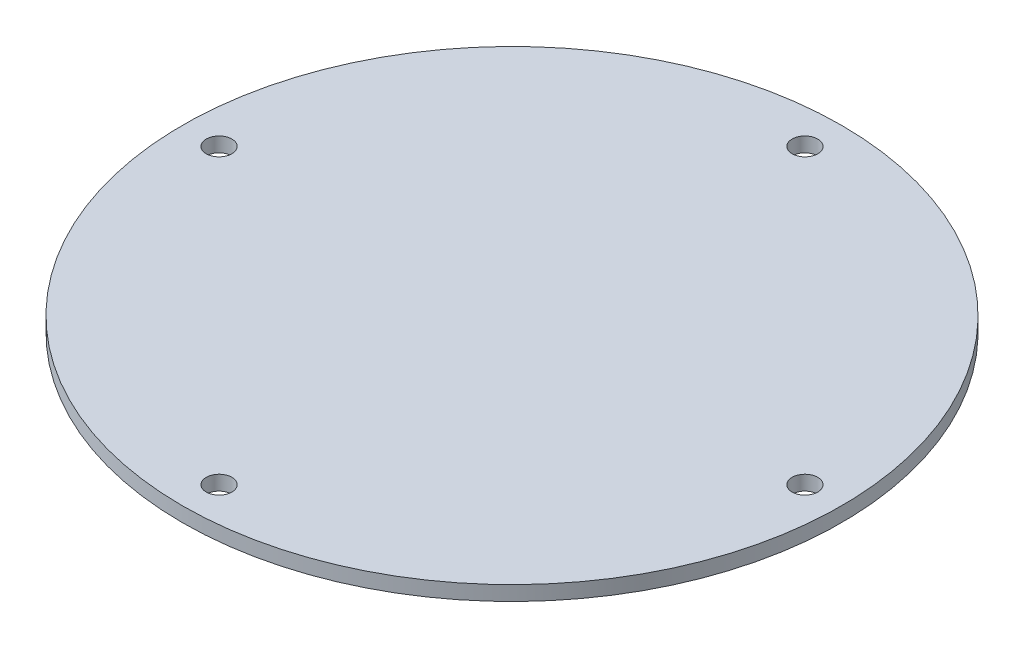
ISO-10303-21;
HEADER;
FILE_DESCRIPTION(('STEP AP214'),'2;1');
FILE_NAME('part.step','',(''),(''),'','','');
FILE_SCHEMA(('AUTOMOTIVE_DESIGN { 1 0 10303 214 1 1 1 1 }'));
ENDSEC;
DATA;
#1=APPLICATION_CONTEXT('core data for automotive mechanical design processes');
#2=APPLICATION_PROTOCOL_DEFINITION('international standard','automotive_design',2000,#1);
#3=PRODUCT_CONTEXT('',#1,'mechanical');
#4=PRODUCT('Part','Part','',(#3));
#5=PRODUCT_RELATED_PRODUCT_CATEGORY('part','',(#4));
#6=PRODUCT_DEFINITION_FORMATION('','',#4);
#7=PRODUCT_DEFINITION_CONTEXT('part definition',#1,'design');
#8=PRODUCT_DEFINITION('design','',#6,#7);
#9=PRODUCT_DEFINITION_SHAPE('','',#8);
#10=(LENGTH_UNIT() NAMED_UNIT(*) SI_UNIT(.MILLI.,.METRE.));
#11=(NAMED_UNIT(*) PLANE_ANGLE_UNIT() SI_UNIT($,.RADIAN.));
#12=(NAMED_UNIT(*) SI_UNIT($,.STERADIAN.) SOLID_ANGLE_UNIT());
#13=UNCERTAINTY_MEASURE_WITH_UNIT(LENGTH_MEASURE(1.E-05),#10,'distance_accuracy_value','');
#14=(GEOMETRIC_REPRESENTATION_CONTEXT(3) GLOBAL_UNCERTAINTY_ASSIGNED_CONTEXT((#13)) GLOBAL_UNIT_ASSIGNED_CONTEXT((#10,
#11,#12)) REPRESENTATION_CONTEXT('',''));
#15=CARTESIAN_POINT('',(0.,0.,0.));
#16=DIRECTION('',(0.,0.,1.));
#17=DIRECTION('',(1.,0.,0.));
#18=AXIS2_PLACEMENT_3D('',#15,#16,#17);
#19=CARTESIAN_POINT('',(0.,2.,0.));
#20=DIRECTION('',(0.,-1.,0.));
#21=DIRECTION('',(0.,0.,-1.));
#22=AXIS2_PLACEMENT_3D('',#19,#20,#21);
#23=CYLINDRICAL_SURFACE('',#22,45.);
#24=CARTESIAN_POINT('',(0.,2.,0.));
#25=DIRECTION('',(0.,1.,0.));
#26=DIRECTION('',(0.,0.,1.));
#27=AXIS2_PLACEMENT_3D('',#24,#25,#26);
#28=CIRCLE('',#27,45.);
#29=CARTESIAN_POINT('',(0.,2.,45.));
#30=VERTEX_POINT('',#29);
#31=EDGE_CURVE('E10',#30,#30,#28,.T.);
#32=ORIENTED_EDGE('',*,*,#31,.F.);
#33=EDGE_LOOP('',(#32));
#34=FACE_BOUND('',#33,.T.);
#35=CARTESIAN_POINT('',(0.,0.,0.));
#36=DIRECTION('',(0.,1.,0.));
#37=DIRECTION('',(0.,0.,1.));
#38=AXIS2_PLACEMENT_3D('',#35,#36,#37);
#39=CIRCLE('',#38,45.);
#40=CARTESIAN_POINT('',(0.,0.,45.));
#41=VERTEX_POINT('',#40);
#42=EDGE_CURVE('E38',#41,#41,#39,.T.);
#43=ORIENTED_EDGE('',*,*,#42,.T.);
#44=EDGE_LOOP('',(#43));
#45=FACE_BOUND('',#44,.T.);
#46=ADVANCED_FACE('F35',(#34,#45),#23,.T.);
#47=CARTESIAN_POINT('',(0.,2.,0.));
#48=DIRECTION('',(0.,1.,0.));
#49=DIRECTION('',(0.,0.,1.));
#50=AXIS2_PLACEMENT_3D('',#47,#48,#49);
#51=PLANE('',#50);
#52=CARTESIAN_POINT('',(0.,2.,-40.));
#53=DIRECTION('',(0.,1.,0.));
#54=DIRECTION('',(0.,0.,1.));
#55=AXIS2_PLACEMENT_3D('',#52,#53,#54);
#56=CIRCLE('',#55,1.75);
#57=CARTESIAN_POINT('',(0.,2.,-38.25));
#58=VERTEX_POINT('',#57);
#59=EDGE_CURVE('E65',#58,#58,#56,.T.);
#60=ORIENTED_EDGE('',*,*,#59,.F.);
#61=EDGE_LOOP('',(#60));
#62=FACE_BOUND('',#61,.T.);
#63=CARTESIAN_POINT('',(40.,2.,0.));
#64=DIRECTION('',(0.,1.,0.));
#65=DIRECTION('',(0.,0.,1.));
#66=AXIS2_PLACEMENT_3D('',#63,#64,#65);
#67=CIRCLE('',#66,1.75);
#68=CARTESIAN_POINT('',(40.,2.,1.75));
#69=VERTEX_POINT('',#68);
#70=EDGE_CURVE('E62',#69,#69,#67,.T.);
#71=ORIENTED_EDGE('',*,*,#70,.F.);
#72=EDGE_LOOP('',(#71));
#73=FACE_BOUND('',#72,.T.);
#74=CARTESIAN_POINT('',(0.,2.,40.));
#75=DIRECTION('',(0.,1.,0.));
#76=DIRECTION('',(0.,0.,1.));
#77=AXIS2_PLACEMENT_3D('',#74,#75,#76);
#78=CIRCLE('',#77,1.75);
#79=CARTESIAN_POINT('',(0.,2.,41.75));
#80=VERTEX_POINT('',#79);
#81=EDGE_CURVE('E56',#80,#80,#78,.T.);
#82=ORIENTED_EDGE('',*,*,#81,.F.);
#83=EDGE_LOOP('',(#82));
#84=FACE_BOUND('',#83,.T.);
#85=CARTESIAN_POINT('',(-40.,2.,0.));
#86=DIRECTION('',(0.,1.,0.));
#87=DIRECTION('',(0.,0.,1.));
#88=AXIS2_PLACEMENT_3D('',#85,#86,#87);
#89=CIRCLE('',#88,1.75);
#90=CARTESIAN_POINT('',(-40.,2.,1.75000000000001));
#91=VERTEX_POINT('',#90);
#92=EDGE_CURVE('E50',#91,#91,#89,.T.);
#93=ORIENTED_EDGE('',*,*,#92,.F.);
#94=EDGE_LOOP('',(#93));
#95=FACE_BOUND('',#94,.T.);
#96=ORIENTED_EDGE('',*,*,#31,.T.);
#97=EDGE_LOOP('',(#96));
#98=FACE_BOUND('',#97,.T.);
#99=ADVANCED_FACE('F81',(#62,#73,#84,#95,#98),#51,.T.);
#100=CARTESIAN_POINT('',(0.,0.,0.));
#101=DIRECTION('',(0.,1.,0.));
#102=DIRECTION('',(0.,0.,1.));
#103=AXIS2_PLACEMENT_3D('',#100,#101,#102);
#104=PLANE('',#103);
#105=CARTESIAN_POINT('',(0.,0.,-40.));
#106=DIRECTION('',(0.,1.,0.));
#107=DIRECTION('',(0.,0.,1.));
#108=AXIS2_PLACEMENT_3D('',#105,#106,#107);
#109=CIRCLE('',#108,1.75);
#110=CARTESIAN_POINT('',(0.,0.,-38.25));
#111=VERTEX_POINT('',#110);
#112=EDGE_CURVE('E45',#111,#111,#109,.T.);
#113=ORIENTED_EDGE('',*,*,#112,.T.);
#114=EDGE_LOOP('',(#113));
#115=FACE_BOUND('',#114,.T.);
#116=CARTESIAN_POINT('',(40.,0.,0.));
#117=DIRECTION('',(0.,1.,0.));
#118=DIRECTION('',(0.,0.,1.));
#119=AXIS2_PLACEMENT_3D('',#116,#117,#118);
#120=CIRCLE('',#119,1.75);
#121=CARTESIAN_POINT('',(40.,0.,1.75));
#122=VERTEX_POINT('',#121);
#123=EDGE_CURVE('E59',#122,#122,#120,.T.);
#124=ORIENTED_EDGE('',*,*,#123,.T.);
#125=EDGE_LOOP('',(#124));
#126=FACE_BOUND('',#125,.T.);
#127=CARTESIAN_POINT('',(0.,0.,40.));
#128=DIRECTION('',(0.,1.,0.));
#129=DIRECTION('',(0.,0.,1.));
#130=AXIS2_PLACEMENT_3D('',#127,#128,#129);
#131=CIRCLE('',#130,1.75);
#132=CARTESIAN_POINT('',(0.,0.,41.75));
#133=VERTEX_POINT('',#132);
#134=EDGE_CURVE('E53',#133,#133,#131,.T.);
#135=ORIENTED_EDGE('',*,*,#134,.T.);
#136=EDGE_LOOP('',(#135));
#137=FACE_BOUND('',#136,.T.);
#138=CARTESIAN_POINT('',(-40.,0.,0.));
#139=DIRECTION('',(0.,1.,0.));
#140=DIRECTION('',(0.,0.,1.));
#141=AXIS2_PLACEMENT_3D('',#138,#139,#140);
#142=CIRCLE('',#141,1.75);
#143=CARTESIAN_POINT('',(-40.,0.,1.75000000000001));
#144=VERTEX_POINT('',#143);
#145=EDGE_CURVE('E47',#144,#144,#142,.T.);
#146=ORIENTED_EDGE('',*,*,#145,.T.);
#147=EDGE_LOOP('',(#146));
#148=FACE_BOUND('',#147,.T.);
#149=ORIENTED_EDGE('',*,*,#42,.F.);
#150=EDGE_LOOP('',(#149));
#151=FACE_BOUND('',#150,.T.);
#152=ADVANCED_FACE('F71',(#115,#126,#137,#148,#151),#104,.F.);
#153=CARTESIAN_POINT('',(-40.,0.,0.));
#154=DIRECTION('',(0.,1.,0.));
#155=DIRECTION('',(0.,0.,1.));
#156=AXIS2_PLACEMENT_3D('',#153,#154,#155);
#157=CYLINDRICAL_SURFACE('',#156,1.75);
#158=ORIENTED_EDGE('',*,*,#145,.F.);
#159=EDGE_LOOP('',(#158));
#160=FACE_BOUND('',#159,.T.);
#161=ORIENTED_EDGE('',*,*,#92,.T.);
#162=EDGE_LOOP('',(#161));
#163=FACE_BOUND('',#162,.T.);
#164=ADVANCED_FACE('F91',(#160,#163),#157,.F.);
#165=CARTESIAN_POINT('',(0.,0.,40.));
#166=DIRECTION('',(0.,1.,0.));
#167=DIRECTION('',(0.,0.,1.));
#168=AXIS2_PLACEMENT_3D('',#165,#166,#167);
#169=CYLINDRICAL_SURFACE('',#168,1.75);
#170=ORIENTED_EDGE('',*,*,#134,.F.);
#171=EDGE_LOOP('',(#170));
#172=FACE_BOUND('',#171,.T.);
#173=ORIENTED_EDGE('',*,*,#81,.T.);
#174=EDGE_LOOP('',(#173));
#175=FACE_BOUND('',#174,.T.);
#176=ADVANCED_FACE('F93',(#172,#175),#169,.F.);
#177=CARTESIAN_POINT('',(40.,0.,0.));
#178=DIRECTION('',(0.,1.,0.));
#179=DIRECTION('',(0.,0.,1.));
#180=AXIS2_PLACEMENT_3D('',#177,#178,#179);
#181=CYLINDRICAL_SURFACE('',#180,1.75);
#182=ORIENTED_EDGE('',*,*,#123,.F.);
#183=EDGE_LOOP('',(#182));
#184=FACE_BOUND('',#183,.T.);
#185=ORIENTED_EDGE('',*,*,#70,.T.);
#186=EDGE_LOOP('',(#185));
#187=FACE_BOUND('',#186,.T.);
#188=ADVANCED_FACE('F77',(#184,#187),#181,.F.);
#189=CARTESIAN_POINT('',(0.,0.,-40.));
#190=DIRECTION('',(0.,1.,0.));
#191=DIRECTION('',(0.,0.,1.));
#192=AXIS2_PLACEMENT_3D('',#189,#190,#191);
#193=CYLINDRICAL_SURFACE('',#192,1.75);
#194=ORIENTED_EDGE('',*,*,#112,.F.);
#195=EDGE_LOOP('',(#194));
#196=FACE_BOUND('',#195,.T.);
#197=ORIENTED_EDGE('',*,*,#59,.T.);
#198=EDGE_LOOP('',(#197));
#199=FACE_BOUND('',#198,.T.);
#200=ADVANCED_FACE('F74',(#196,#199),#193,.F.);
#201=CLOSED_SHELL('',(#46,#99,#152,#164,#176,#188,#200));
#202=MANIFOLD_SOLID_BREP('B2',#201);
#203=ADVANCED_BREP_SHAPE_REPRESENTATION('',(#18,#202),#14);
#204=SHAPE_DEFINITION_REPRESENTATION(#9,#203);
ENDSEC;
END-ISO-10303-21;
